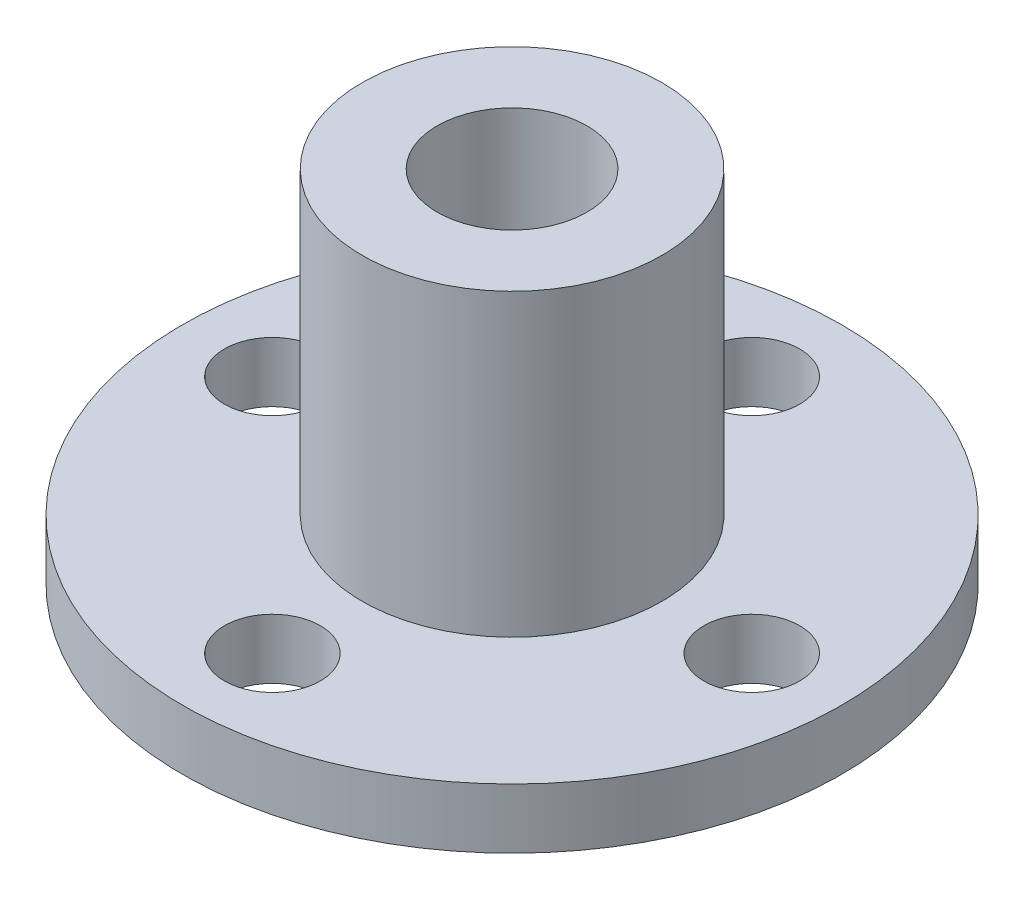
ISO-10303-21;
HEADER;
FILE_DESCRIPTION(('STEP AP214'),'2;1');
FILE_NAME('part.step','',(''),(''),'','','');
FILE_SCHEMA(('AUTOMOTIVE_DESIGN { 1 0 10303 214 1 1 1 1 }'));
ENDSEC;
DATA;
#1=APPLICATION_CONTEXT('core data for automotive mechanical design processes');
#2=APPLICATION_PROTOCOL_DEFINITION('international standard','automotive_design',2000,#1);
#3=PRODUCT_CONTEXT('',#1,'mechanical');
#4=PRODUCT('Part','Part','',(#3));
#5=PRODUCT_RELATED_PRODUCT_CATEGORY('part','',(#4));
#6=PRODUCT_DEFINITION_FORMATION('','',#4);
#7=PRODUCT_DEFINITION_CONTEXT('part definition',#1,'design');
#8=PRODUCT_DEFINITION('design','',#6,#7);
#9=PRODUCT_DEFINITION_SHAPE('','',#8);
#10=(LENGTH_UNIT() NAMED_UNIT(*) SI_UNIT(.MILLI.,.METRE.));
#11=(NAMED_UNIT(*) PLANE_ANGLE_UNIT() SI_UNIT($,.RADIAN.));
#12=(NAMED_UNIT(*) SI_UNIT($,.STERADIAN.) SOLID_ANGLE_UNIT());
#13=UNCERTAINTY_MEASURE_WITH_UNIT(LENGTH_MEASURE(1.E-05),#10,'distance_accuracy_value','');
#14=(GEOMETRIC_REPRESENTATION_CONTEXT(3) GLOBAL_UNCERTAINTY_ASSIGNED_CONTEXT((#13)) GLOBAL_UNIT_ASSIGNED_CONTEXT((#10,
#11,#12)) REPRESENTATION_CONTEXT('',''));
#15=CARTESIAN_POINT('',(0.,0.,0.));
#16=DIRECTION('',(0.,0.,1.));
#17=DIRECTION('',(1.,0.,0.));
#18=AXIS2_PLACEMENT_3D('',#15,#16,#17);
#19=CARTESIAN_POINT('',(0.,0.,0.));
#20=DIRECTION('',(0.,-1.,0.));
#21=DIRECTION('',(0.,0.,-1.));
#22=AXIS2_PLACEMENT_3D('',#19,#20,#21);
#23=CYLINDRICAL_SURFACE('',#22,11.);
#24=CARTESIAN_POINT('',(0.,0.,0.));
#25=DIRECTION('',(0.,-1.,0.));
#26=DIRECTION('',(0.,0.,-1.));
#27=AXIS2_PLACEMENT_3D('',#24,#25,#26);
#28=CIRCLE('',#27,11.);
#29=CARTESIAN_POINT('',(0.,0.,-11.));
#30=VERTEX_POINT('',#29);
#31=EDGE_CURVE('E61',#30,#30,#28,.T.);
#32=ORIENTED_EDGE('',*,*,#31,.F.);
#33=EDGE_LOOP('',(#32));
#34=FACE_BOUND('',#33,.T.);
#35=CARTESIAN_POINT('',(0.,2.,0.));
#36=DIRECTION('',(0.,-1.,0.));
#37=DIRECTION('',(0.,0.,-1.));
#38=AXIS2_PLACEMENT_3D('',#35,#36,#37);
#39=CIRCLE('',#38,11.);
#40=CARTESIAN_POINT('',(0.,2.,-11.));
#41=VERTEX_POINT('',#40);
#42=EDGE_CURVE('E10',#41,#41,#39,.T.);
#43=ORIENTED_EDGE('',*,*,#42,.T.);
#44=EDGE_LOOP('',(#43));
#45=FACE_BOUND('',#44,.T.);
#46=ADVANCED_FACE('F34',(#34,#45),#23,.T.);
#47=CARTESIAN_POINT('',(-11.,2.,0.));
#48=DIRECTION('',(0.,-1.,0.));
#49=DIRECTION('',(0.,0.,-1.));
#50=AXIS2_PLACEMENT_3D('',#47,#48,#49);
#51=PLANE('',#50);
#52=CARTESIAN_POINT('',(-8.,2.,0.));
#53=DIRECTION('',(0.,1.,0.));
#54=DIRECTION('',(0.,0.,1.));
#55=AXIS2_PLACEMENT_3D('',#52,#53,#54);
#56=CIRCLE('',#55,1.6);
#57=CARTESIAN_POINT('',(-8.,2.,1.6));
#58=VERTEX_POINT('',#57);
#59=EDGE_CURVE('E54',#58,#58,#56,.T.);
#60=ORIENTED_EDGE('',*,*,#59,.F.);
#61=EDGE_LOOP('',(#60));
#62=FACE_BOUND('',#61,.T.);
#63=CARTESIAN_POINT('',(0.,2.,-8.));
#64=DIRECTION('',(0.,1.,0.));
#65=DIRECTION('',(0.,0.,1.));
#66=AXIS2_PLACEMENT_3D('',#63,#64,#65);
#67=CIRCLE('',#66,1.6);
#68=CARTESIAN_POINT('',(0.,2.,-6.4));
#69=VERTEX_POINT('',#68);
#70=EDGE_CURVE('E122',#69,#69,#67,.T.);
#71=ORIENTED_EDGE('',*,*,#70,.F.);
#72=EDGE_LOOP('',(#71));
#73=FACE_BOUND('',#72,.T.);
#74=CARTESIAN_POINT('',(8.,2.,0.));
#75=DIRECTION('',(0.,1.,0.));
#76=DIRECTION('',(0.,0.,1.));
#77=AXIS2_PLACEMENT_3D('',#74,#75,#76);
#78=CIRCLE('',#77,1.6);
#79=CARTESIAN_POINT('',(8.,2.,1.6));
#80=VERTEX_POINT('',#79);
#81=EDGE_CURVE('E126',#80,#80,#78,.T.);
#82=ORIENTED_EDGE('',*,*,#81,.F.);
#83=EDGE_LOOP('',(#82));
#84=FACE_BOUND('',#83,.T.);
#85=CARTESIAN_POINT('',(0.,2.,8.));
#86=DIRECTION('',(0.,1.,0.));
#87=DIRECTION('',(0.,0.,1.));
#88=AXIS2_PLACEMENT_3D('',#85,#86,#87);
#89=CIRCLE('',#88,1.6);
#90=CARTESIAN_POINT('',(0.,2.,9.6));
#91=VERTEX_POINT('',#90);
#92=EDGE_CURVE('E73',#91,#91,#89,.T.);
#93=ORIENTED_EDGE('',*,*,#92,.F.);
#94=EDGE_LOOP('',(#93));
#95=FACE_BOUND('',#94,.T.);
#96=ORIENTED_EDGE('',*,*,#42,.F.);
#97=EDGE_LOOP('',(#96));
#98=FACE_BOUND('',#97,.T.);
#99=CARTESIAN_POINT('',(0.,2.,0.));
#100=DIRECTION('',(0.,-1.,0.));
#101=DIRECTION('',(0.,0.,-1.));
#102=AXIS2_PLACEMENT_3D('',#99,#100,#101);
#103=CIRCLE('',#102,5.);
#104=CARTESIAN_POINT('',(0.,2.,-5.));
#105=VERTEX_POINT('',#104);
#106=EDGE_CURVE('E41',#105,#105,#103,.T.);
#107=ORIENTED_EDGE('',*,*,#106,.T.);
#108=EDGE_LOOP('',(#107));
#109=FACE_BOUND('',#108,.T.);
#110=ADVANCED_FACE('F105',(#62,#73,#84,#95,#98,#109),#51,.F.);
#111=CARTESIAN_POINT('',(0.,0.,0.));
#112=DIRECTION('',(0.,-1.,0.));
#113=DIRECTION('',(0.,0.,-1.));
#114=AXIS2_PLACEMENT_3D('',#111,#112,#113);
#115=CYLINDRICAL_SURFACE('',#114,5.);
#116=ORIENTED_EDGE('',*,*,#106,.F.);
#117=EDGE_LOOP('',(#116));
#118=FACE_BOUND('',#117,.T.);
#119=CARTESIAN_POINT('',(0.,12.,0.));
#120=DIRECTION('',(0.,-1.,0.));
#121=DIRECTION('',(0.,0.,-1.));
#122=AXIS2_PLACEMENT_3D('',#119,#120,#121);
#123=CIRCLE('',#122,5.);
#124=CARTESIAN_POINT('',(0.,12.,-5.));
#125=VERTEX_POINT('',#124);
#126=EDGE_CURVE('E46',#125,#125,#123,.T.);
#127=ORIENTED_EDGE('',*,*,#126,.T.);
#128=EDGE_LOOP('',(#127));
#129=FACE_BOUND('',#128,.T.);
#130=ADVANCED_FACE('F80',(#118,#129),#115,.T.);
#131=CARTESIAN_POINT('',(-5.,12.,0.));
#132=DIRECTION('',(0.,-1.,0.));
#133=DIRECTION('',(0.,0.,-1.));
#134=AXIS2_PLACEMENT_3D('',#131,#132,#133);
#135=PLANE('',#134);
#136=ORIENTED_EDGE('',*,*,#126,.F.);
#137=EDGE_LOOP('',(#136));
#138=FACE_BOUND('',#137,.T.);
#139=CARTESIAN_POINT('',(0.,12.,0.));
#140=DIRECTION('',(0.,-1.,0.));
#141=DIRECTION('',(0.,0.,-1.));
#142=AXIS2_PLACEMENT_3D('',#139,#140,#141);
#143=CIRCLE('',#142,2.5);
#144=CARTESIAN_POINT('',(0.,12.,-2.5));
#145=VERTEX_POINT('',#144);
#146=EDGE_CURVE('E70',#145,#145,#143,.T.);
#147=ORIENTED_EDGE('',*,*,#146,.T.);
#148=EDGE_LOOP('',(#147));
#149=FACE_BOUND('',#148,.T.);
#150=ADVANCED_FACE('F82',(#138,#149),#135,.F.);
#151=CARTESIAN_POINT('',(0.,0.,0.));
#152=DIRECTION('',(0.,-1.,0.));
#153=DIRECTION('',(0.,0.,-1.));
#154=AXIS2_PLACEMENT_3D('',#151,#152,#153);
#155=CYLINDRICAL_SURFACE('',#154,2.5);
#156=ORIENTED_EDGE('',*,*,#146,.F.);
#157=EDGE_LOOP('',(#156));
#158=FACE_BOUND('',#157,.T.);
#159=CARTESIAN_POINT('',(0.,0.,0.));
#160=DIRECTION('',(0.,-1.,0.));
#161=DIRECTION('',(0.,0.,-1.));
#162=AXIS2_PLACEMENT_3D('',#159,#160,#161);
#163=CIRCLE('',#162,2.5);
#164=CARTESIAN_POINT('',(0.,0.,-2.5));
#165=VERTEX_POINT('',#164);
#166=EDGE_CURVE('E65',#165,#165,#163,.T.);
#167=ORIENTED_EDGE('',*,*,#166,.T.);
#168=EDGE_LOOP('',(#167));
#169=FACE_BOUND('',#168,.T.);
#170=ADVANCED_FACE('F85',(#158,#169),#155,.F.);
#171=CARTESIAN_POINT('',(-11.,0.,0.));
#172=DIRECTION('',(0.,1.,0.));
#173=DIRECTION('',(0.,0.,1.));
#174=AXIS2_PLACEMENT_3D('',#171,#172,#173);
#175=PLANE('',#174);
#176=CARTESIAN_POINT('',(-8.,0.,0.));
#177=DIRECTION('',(0.,1.,0.));
#178=DIRECTION('',(0.,0.,1.));
#179=AXIS2_PLACEMENT_3D('',#176,#177,#178);
#180=CIRCLE('',#179,1.6);
#181=CARTESIAN_POINT('',(-8.,0.,1.6));
#182=VERTEX_POINT('',#181);
#183=EDGE_CURVE('E37',#182,#182,#180,.T.);
#184=ORIENTED_EDGE('',*,*,#183,.T.);
#185=EDGE_LOOP('',(#184));
#186=FACE_BOUND('',#185,.T.);
#187=CARTESIAN_POINT('',(0.,0.,-8.));
#188=DIRECTION('',(0.,1.,0.));
#189=DIRECTION('',(0.,0.,1.));
#190=AXIS2_PLACEMENT_3D('',#187,#188,#189);
#191=CIRCLE('',#190,1.6);
#192=CARTESIAN_POINT('',(0.,0.,-6.4));
#193=VERTEX_POINT('',#192);
#194=EDGE_CURVE('E56',#193,#193,#191,.T.);
#195=ORIENTED_EDGE('',*,*,#194,.T.);
#196=EDGE_LOOP('',(#195));
#197=FACE_BOUND('',#196,.T.);
#198=CARTESIAN_POINT('',(8.,0.,0.));
#199=DIRECTION('',(0.,1.,0.));
#200=DIRECTION('',(0.,0.,1.));
#201=AXIS2_PLACEMENT_3D('',#198,#199,#200);
#202=CIRCLE('',#201,1.6);
#203=CARTESIAN_POINT('',(8.,0.,1.6));
#204=VERTEX_POINT('',#203);
#205=EDGE_CURVE('E53',#204,#204,#202,.T.);
#206=ORIENTED_EDGE('',*,*,#205,.T.);
#207=EDGE_LOOP('',(#206));
#208=FACE_BOUND('',#207,.T.);
#209=CARTESIAN_POINT('',(0.,0.,8.));
#210=DIRECTION('',(0.,1.,0.));
#211=DIRECTION('',(0.,0.,1.));
#212=AXIS2_PLACEMENT_3D('',#209,#210,#211);
#213=CIRCLE('',#212,1.6);
#214=CARTESIAN_POINT('',(0.,0.,9.6));
#215=VERTEX_POINT('',#214);
#216=EDGE_CURVE('E50',#215,#215,#213,.T.);
#217=ORIENTED_EDGE('',*,*,#216,.T.);
#218=EDGE_LOOP('',(#217));
#219=FACE_BOUND('',#218,.T.);
#220=ORIENTED_EDGE('',*,*,#166,.F.);
#221=EDGE_LOOP('',(#220));
#222=FACE_BOUND('',#221,.T.);
#223=ORIENTED_EDGE('',*,*,#31,.T.);
#224=EDGE_LOOP('',(#223));
#225=FACE_BOUND('',#224,.T.);
#226=ADVANCED_FACE('F91',(#186,#197,#208,#219,#222,#225),#175,.F.);
#227=CARTESIAN_POINT('',(0.,-8.,8.));
#228=DIRECTION('',(0.,1.,0.));
#229=DIRECTION('',(0.,0.,1.));
#230=AXIS2_PLACEMENT_3D('',#227,#228,#229);
#231=CYLINDRICAL_SURFACE('',#230,1.6);
#232=ORIENTED_EDGE('',*,*,#92,.T.);
#233=EDGE_LOOP('',(#232));
#234=FACE_BOUND('',#233,.T.);
#235=ORIENTED_EDGE('',*,*,#216,.F.);
#236=EDGE_LOOP('',(#235));
#237=FACE_BOUND('',#236,.T.);
#238=ADVANCED_FACE('F96',(#234,#237),#231,.F.);
#239=CARTESIAN_POINT('',(8.,-8.,0.));
#240=DIRECTION('',(0.,1.,0.));
#241=DIRECTION('',(0.,0.,1.));
#242=AXIS2_PLACEMENT_3D('',#239,#240,#241);
#243=CYLINDRICAL_SURFACE('',#242,1.6);
#244=ORIENTED_EDGE('',*,*,#81,.T.);
#245=EDGE_LOOP('',(#244));
#246=FACE_BOUND('',#245,.T.);
#247=ORIENTED_EDGE('',*,*,#205,.F.);
#248=EDGE_LOOP('',(#247));
#249=FACE_BOUND('',#248,.T.);
#250=ADVANCED_FACE('F101',(#246,#249),#243,.F.);
#251=CARTESIAN_POINT('',(0.,-8.,-8.));
#252=DIRECTION('',(0.,1.,0.));
#253=DIRECTION('',(0.,0.,1.));
#254=AXIS2_PLACEMENT_3D('',#251,#252,#253);
#255=CYLINDRICAL_SURFACE('',#254,1.6);
#256=ORIENTED_EDGE('',*,*,#70,.T.);
#257=EDGE_LOOP('',(#256));
#258=FACE_BOUND('',#257,.T.);
#259=ORIENTED_EDGE('',*,*,#194,.F.);
#260=EDGE_LOOP('',(#259));
#261=FACE_BOUND('',#260,.T.);
#262=ADVANCED_FACE('F139',(#258,#261),#255,.F.);
#263=CARTESIAN_POINT('',(-8.,-8.,0.));
#264=DIRECTION('',(0.,1.,0.));
#265=DIRECTION('',(0.,0.,1.));
#266=AXIS2_PLACEMENT_3D('',#263,#264,#265);
#267=CYLINDRICAL_SURFACE('',#266,1.6);
#268=ORIENTED_EDGE('',*,*,#59,.T.);
#269=EDGE_LOOP('',(#268));
#270=FACE_BOUND('',#269,.T.);
#271=ORIENTED_EDGE('',*,*,#183,.F.);
#272=EDGE_LOOP('',(#271));
#273=FACE_BOUND('',#272,.T.);
#274=ADVANCED_FACE('F136',(#270,#273),#267,.F.);
#275=CLOSED_SHELL('',(#46,#110,#130,#150,#170,#226,#238,#250,#262,#274));
#276=MANIFOLD_SOLID_BREP('B2',#275);
#277=ADVANCED_BREP_SHAPE_REPRESENTATION('',(#18,#276),#14);
#278=SHAPE_DEFINITION_REPRESENTATION(#9,#277);
ENDSEC;
END-ISO-10303-21;
